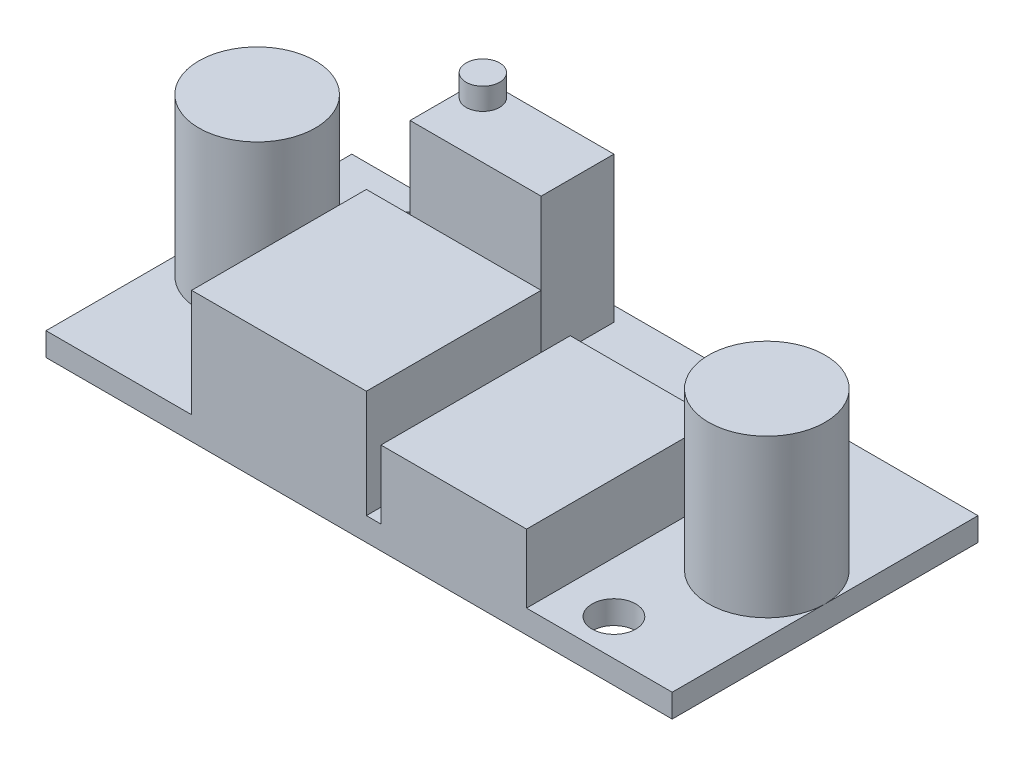
ISO-10303-21;
HEADER;
FILE_DESCRIPTION(('STEP AP214'),'2;1');
FILE_NAME('part.step','',(''),(''),'','','');
FILE_SCHEMA(('AUTOMOTIVE_DESIGN { 1 0 10303 214 1 1 1 1 }'));
ENDSEC;
DATA;
#1=APPLICATION_CONTEXT('core data for automotive mechanical design processes');
#2=APPLICATION_PROTOCOL_DEFINITION('international standard','automotive_design',2000,#1);
#3=PRODUCT_CONTEXT('',#1,'mechanical');
#4=PRODUCT('Part','Part','',(#3));
#5=PRODUCT_RELATED_PRODUCT_CATEGORY('part','',(#4));
#6=PRODUCT_DEFINITION_FORMATION('','',#4);
#7=PRODUCT_DEFINITION_CONTEXT('part definition',#1,'design');
#8=PRODUCT_DEFINITION('design','',#6,#7);
#9=PRODUCT_DEFINITION_SHAPE('','',#8);
#10=(LENGTH_UNIT() NAMED_UNIT(*) SI_UNIT(.MILLI.,.METRE.));
#11=(NAMED_UNIT(*) PLANE_ANGLE_UNIT() SI_UNIT($,.RADIAN.));
#12=(NAMED_UNIT(*) SI_UNIT($,.STERADIAN.) SOLID_ANGLE_UNIT());
#13=UNCERTAINTY_MEASURE_WITH_UNIT(LENGTH_MEASURE(1.E-05),#10,'distance_accuracy_value','');
#14=(GEOMETRIC_REPRESENTATION_CONTEXT(3) GLOBAL_UNCERTAINTY_ASSIGNED_CONTEXT((#13)) GLOBAL_UNIT_ASSIGNED_CONTEXT((#10,
#11,#12)) REPRESENTATION_CONTEXT('',''));
#15=CARTESIAN_POINT('',(0.,0.,0.));
#16=DIRECTION('',(0.,0.,1.));
#17=DIRECTION('',(1.,0.,0.));
#18=AXIS2_PLACEMENT_3D('',#15,#16,#17);
#19=CARTESIAN_POINT('',(0.,11.6,0.));
#20=DIRECTION('',(0.,1.,0.));
#21=DIRECTION('',(0.,0.,1.));
#22=AXIS2_PLACEMENT_3D('',#19,#20,#21);
#23=PLANE('',#22);
#24=CARTESIAN_POINT('',(-10.35,11.6,-8.35));
#25=DIRECTION('',(0.,1.,0.));
#26=DIRECTION('',(0.,0.,1.));
#27=AXIS2_PLACEMENT_3D('',#24,#25,#26);
#28=CIRCLE('',#27,1.15);
#29=CARTESIAN_POINT('',(-10.35,11.6,-9.5));
#30=VERTEX_POINT('',#29);
#31=CARTESIAN_POINT('',(-11.5,11.6,-8.35));
#32=VERTEX_POINT('',#31);
#33=EDGE_CURVE('E45',#30,#32,#28,.T.);
#34=ORIENTED_EDGE('',*,*,#33,.F.);
#35=DIRECTION('',(1.,0.,0.));
#36=VECTOR('',#35,1.);
#37=CARTESIAN_POINT('',(0.,11.6,-9.5));
#38=LINE('',#37,#36);
#39=CARTESIAN_POINT('',(-11.5,11.6,-9.5));
#40=VERTEX_POINT('',#39);
#41=EDGE_CURVE('E162',#40,#30,#38,.T.);
#42=ORIENTED_EDGE('',*,*,#41,.F.);
#43=DIRECTION('',(0.,0.,1.));
#44=VECTOR('',#43,1.);
#45=CARTESIAN_POINT('',(-11.5,11.6,0.));
#46=LINE('',#45,#44);
#47=EDGE_CURVE('E179',#40,#32,#46,.T.);
#48=ORIENTED_EDGE('',*,*,#47,.T.);
#49=EDGE_LOOP('',(#34,#42,#48));
#50=FACE_BOUND('',#49,.T.);
#51=ADVANCED_FACE('F35',(#50),#23,.T.);
#52=CARTESIAN_POINT('',(0.,1.6,0.));
#53=DIRECTION('',(0.,1.,0.));
#54=DIRECTION('',(0.,0.,1.));
#55=AXIS2_PLACEMENT_3D('',#52,#53,#54);
#56=PLANE('',#55);
#57=DIRECTION('',(0.,0.,1.));
#58=VECTOR('',#57,1.);
#59=CARTESIAN_POINT('',(-2.5,1.6,0.));
#60=LINE('',#59,#58);
#61=CARTESIAN_POINT('',(-2.5,1.6,-9.5));
#62=VERTEX_POINT('',#61);
#63=CARTESIAN_POINT('',(-2.5,1.6,-4.5));
#64=VERTEX_POINT('',#63);
#65=EDGE_CURVE('E454',#62,#64,#60,.T.);
#66=ORIENTED_EDGE('',*,*,#65,.T.);
#67=DIRECTION('',(1.,0.,0.));
#68=VECTOR('',#67,1.);
#69=CARTESIAN_POINT('',(0.,1.6,-4.5));
#70=LINE('',#69,#68);
#71=CARTESIAN_POINT('',(-11.5,1.6,-4.5));
#72=VERTEX_POINT('',#71);
#73=EDGE_CURVE('E447',#72,#64,#70,.T.);
#74=ORIENTED_EDGE('',*,*,#73,.F.);
#75=DIRECTION('',(0.,0.,1.));
#76=VECTOR('',#75,1.);
#77=CARTESIAN_POINT('',(-11.5,1.6,0.));
#78=LINE('',#77,#76);
#79=CARTESIAN_POINT('',(-11.5,1.6,-9.5));
#80=VERTEX_POINT('',#79);
#81=EDGE_CURVE('E449',#80,#72,#78,.T.);
#82=ORIENTED_EDGE('',*,*,#81,.F.);
#83=DIRECTION('',(1.,0.,0.));
#84=VECTOR('',#83,1.);
#85=CARTESIAN_POINT('',(0.,1.6,-9.5));
#86=LINE('',#85,#84);
#87=EDGE_CURVE('E451',#80,#62,#86,.T.);
#88=ORIENTED_EDGE('',*,*,#87,.T.);
#89=EDGE_LOOP('',(#66,#74,#82,#88));
#90=FACE_BOUND('',#89,.T.);
#91=CARTESIAN_POINT('',(15.,1.6,8.));
#92=DIRECTION('',(0.,1.,0.));
#93=DIRECTION('',(0.,0.,1.));
#94=AXIS2_PLACEMENT_3D('',#91,#92,#93);
#95=CIRCLE('',#94,1.5);
#96=CARTESIAN_POINT('',(15.,1.6,9.5));
#97=VERTEX_POINT('',#96);
#98=EDGE_CURVE('E336',#97,#97,#95,.T.);
#99=ORIENTED_EDGE('',*,*,#98,.F.);
#100=EDGE_LOOP('',(#99));
#101=FACE_BOUND('',#100,.T.);
#102=CARTESIAN_POINT('',(-15.,1.6,-7.99999999999999));
#103=DIRECTION('',(0.,1.,0.));
#104=DIRECTION('',(0.,0.,1.));
#105=AXIS2_PLACEMENT_3D('',#102,#103,#104);
#106=CIRCLE('',#105,1.5);
#107=CARTESIAN_POINT('',(-15.,1.6,-6.49999999999999));
#108=VERTEX_POINT('',#107);
#109=EDGE_CURVE('E346',#108,#108,#106,.T.);
#110=ORIENTED_EDGE('',*,*,#109,.F.);
#111=EDGE_LOOP('',(#110));
#112=FACE_BOUND('',#111,.T.);
#113=DIRECTION('',(1.,0.,0.));
#114=VECTOR('',#113,1.);
#115=CARTESIAN_POINT('',(0.,1.6,-2.5));
#116=LINE('',#115,#114);
#117=CARTESIAN_POINT('',(1.5,1.6,-2.5));
#118=VERTEX_POINT('',#117);
#119=CARTESIAN_POINT('',(11.5,1.6,-2.5));
#120=VERTEX_POINT('',#119);
#121=EDGE_CURVE('E370',#118,#120,#116,.T.);
#122=ORIENTED_EDGE('',*,*,#121,.T.);
#123=DIRECTION('',(0.,0.,-1.));
#124=VECTOR('',#123,1.);
#125=CARTESIAN_POINT('',(11.5,1.6,0.));
#126=LINE('',#125,#124);
#127=CARTESIAN_POINT('',(11.5,1.6,10.5));
#128=VERTEX_POINT('',#127);
#129=EDGE_CURVE('E368',#128,#120,#126,.T.);
#130=ORIENTED_EDGE('',*,*,#129,.F.);
#131=DIRECTION('',(1.,0.,0.));
#132=VECTOR('',#131,1.);
#133=CARTESIAN_POINT('',(-21.5,1.6,10.5));
#134=LINE('',#133,#132);
#135=CARTESIAN_POINT('',(21.5,1.6,10.5));
#136=VERTEX_POINT('',#135);
#137=EDGE_CURVE('E358',#128,#136,#134,.T.);
#138=ORIENTED_EDGE('',*,*,#137,.T.);
#139=DIRECTION('',(0.,0.,-1.));
#140=VECTOR('',#139,1.);
#141=CARTESIAN_POINT('',(21.5,1.6,-10.5));
#142=LINE('',#141,#140);
#143=CARTESIAN_POINT('',(21.5,1.6,0.));
#144=VERTEX_POINT('',#143);
#145=EDGE_CURVE('E354',#136,#144,#142,.T.);
#146=ORIENTED_EDGE('',*,*,#145,.T.);
#147=CARTESIAN_POINT('',(17.5,1.6,0.));
#148=DIRECTION('',(0.,1.,0.));
#149=DIRECTION('',(0.,0.,1.));
#150=AXIS2_PLACEMENT_3D('',#147,#148,#149);
#151=CIRCLE('',#150,4.);
#152=EDGE_CURVE('E339',#144,#144,#151,.T.);
#153=ORIENTED_EDGE('',*,*,#152,.F.);
#154=CARTESIAN_POINT('',(21.5,1.6,-10.5));
#155=VERTEX_POINT('',#154);
#156=EDGE_CURVE('E313',#144,#155,#142,.T.);
#157=ORIENTED_EDGE('',*,*,#156,.T.);
#158=DIRECTION('',(-1.,0.,0.));
#159=VECTOR('',#158,1.);
#160=CARTESIAN_POINT('',(-21.5,1.6,-10.5));
#161=LINE('',#160,#159);
#162=CARTESIAN_POINT('',(-21.5,1.6,-10.5));
#163=VERTEX_POINT('',#162);
#164=EDGE_CURVE('E327',#155,#163,#161,.T.);
#165=ORIENTED_EDGE('',*,*,#164,.T.);
#166=DIRECTION('',(0.,0.,1.));
#167=VECTOR('',#166,1.);
#168=CARTESIAN_POINT('',(-21.5,1.6,-10.5));
#169=LINE('',#168,#167);
#170=CARTESIAN_POINT('',(-21.5,1.6,0.));
#171=VERTEX_POINT('',#170);
#172=EDGE_CURVE('E308',#163,#171,#169,.T.);
#173=ORIENTED_EDGE('',*,*,#172,.T.);
#174=CARTESIAN_POINT('',(-17.5,1.6,0.));
#175=DIRECTION('',(0.,1.,0.));
#176=DIRECTION('',(0.,0.,1.));
#177=AXIS2_PLACEMENT_3D('',#174,#175,#176);
#178=CIRCLE('',#177,4.);
#179=EDGE_CURVE('E330',#171,#171,#178,.T.);
#180=ORIENTED_EDGE('',*,*,#179,.F.);
#181=CARTESIAN_POINT('',(-21.5,1.6,10.5));
#182=VERTEX_POINT('',#181);
#183=EDGE_CURVE('E324',#171,#182,#169,.T.);
#184=ORIENTED_EDGE('',*,*,#183,.T.);
#185=CARTESIAN_POINT('',(-11.5,1.6,10.5));
#186=VERTEX_POINT('',#185);
#187=EDGE_CURVE('E320',#182,#186,#134,.T.);
#188=ORIENTED_EDGE('',*,*,#187,.T.);
#189=DIRECTION('',(0.,0.,-1.));
#190=VECTOR('',#189,1.);
#191=CARTESIAN_POINT('',(-11.5,1.6,0.));
#192=LINE('',#191,#190);
#193=CARTESIAN_POINT('',(-11.5,1.6,-1.5));
#194=VERTEX_POINT('',#193);
#195=EDGE_CURVE('E391',#186,#194,#192,.T.);
#196=ORIENTED_EDGE('',*,*,#195,.T.);
#197=DIRECTION('',(1.,0.,0.));
#198=VECTOR('',#197,1.);
#199=CARTESIAN_POINT('',(0.,1.6,-1.5));
#200=LINE('',#199,#198);
#201=CARTESIAN_POINT('',(0.499999999999999,1.6,-1.5));
#202=VERTEX_POINT('',#201);
#203=EDGE_CURVE('E381',#194,#202,#200,.T.);
#204=ORIENTED_EDGE('',*,*,#203,.T.);
#205=DIRECTION('',(0.,0.,-1.));
#206=VECTOR('',#205,1.);
#207=CARTESIAN_POINT('',(0.499999999999999,1.6,0.));
#208=LINE('',#207,#206);
#209=CARTESIAN_POINT('',(0.499999999999997,1.6,10.5));
#210=VERTEX_POINT('',#209);
#211=EDGE_CURVE('E377',#210,#202,#208,.T.);
#212=ORIENTED_EDGE('',*,*,#211,.F.);
#213=CARTESIAN_POINT('',(1.5,1.6,10.5));
#214=VERTEX_POINT('',#213);
#215=EDGE_CURVE('E359',#210,#214,#134,.T.);
#216=ORIENTED_EDGE('',*,*,#215,.T.);
#217=DIRECTION('',(0.,0.,-1.));
#218=VECTOR('',#217,1.);
#219=CARTESIAN_POINT('',(1.5,1.6,0.));
#220=LINE('',#219,#218);
#221=EDGE_CURVE('E421',#214,#118,#220,.T.);
#222=ORIENTED_EDGE('',*,*,#221,.T.);
#223=EDGE_LOOP('',(#122,#130,#138,#146,#153,#157,#165,#173,#180,#184,#188,#196,#204,#212,#216,#222));
#224=FACE_BOUND('',#223,.T.);
#225=ADVANCED_FACE('F197',(#90,#101,#112,#224),#56,.T.);
#226=CARTESIAN_POINT('',(21.5,1.6,-10.5));
#227=DIRECTION('',(-1.,0.,0.));
#228=DIRECTION('',(0.,0.,1.));
#229=AXIS2_PLACEMENT_3D('',#226,#227,#228);
#230=PLANE('',#229);
#231=DIRECTION('',(0.,0.,-1.));
#232=VECTOR('',#231,1.);
#233=CARTESIAN_POINT('',(21.5,0.,-10.5));
#234=LINE('',#233,#232);
#235=CARTESIAN_POINT('',(21.5,0.,10.5));
#236=VERTEX_POINT('',#235);
#237=CARTESIAN_POINT('',(21.5,0.,-10.5));
#238=VERTEX_POINT('',#237);
#239=EDGE_CURVE('E303',#236,#238,#234,.T.);
#240=ORIENTED_EDGE('',*,*,#239,.T.);
#241=DIRECTION('',(0.,-1.,0.));
#242=VECTOR('',#241,1.);
#243=CARTESIAN_POINT('',(21.5,1.6,-10.5));
#244=LINE('',#243,#242);
#245=EDGE_CURVE('E39',#155,#238,#244,.T.);
#246=ORIENTED_EDGE('',*,*,#245,.F.);
#247=ORIENTED_EDGE('',*,*,#156,.F.);
#248=ORIENTED_EDGE('',*,*,#145,.F.);
#249=DIRECTION('',(0.,-1.,0.));
#250=VECTOR('',#249,1.);
#251=CARTESIAN_POINT('',(21.5,1.6,10.5));
#252=LINE('',#251,#250);
#253=EDGE_CURVE('E317',#136,#236,#252,.T.);
#254=ORIENTED_EDGE('',*,*,#253,.T.);
#255=EDGE_LOOP('',(#240,#246,#247,#248,#254));
#256=FACE_BOUND('',#255,.T.);
#257=ADVANCED_FACE('F37',(#256),#230,.F.);
#258=CARTESIAN_POINT('',(-21.5,1.6,-10.5));
#259=DIRECTION('',(0.,0.,1.));
#260=DIRECTION('',(1.,0.,0.));
#261=AXIS2_PLACEMENT_3D('',#258,#259,#260);
#262=PLANE('',#261);
#263=DIRECTION('',(-1.,0.,0.));
#264=VECTOR('',#263,1.);
#265=CARTESIAN_POINT('',(-21.5,0.,-10.5));
#266=LINE('',#265,#264);
#267=CARTESIAN_POINT('',(-21.5,0.,-10.5));
#268=VERTEX_POINT('',#267);
#269=EDGE_CURVE('E292',#238,#268,#266,.T.);
#270=ORIENTED_EDGE('',*,*,#269,.T.);
#271=DIRECTION('',(0.,-1.,0.));
#272=VECTOR('',#271,1.);
#273=CARTESIAN_POINT('',(-21.5,1.6,-10.5));
#274=LINE('',#273,#272);
#275=EDGE_CURVE('E295',#163,#268,#274,.T.);
#276=ORIENTED_EDGE('',*,*,#275,.F.);
#277=ORIENTED_EDGE('',*,*,#164,.F.);
#278=ORIENTED_EDGE('',*,*,#245,.T.);
#279=EDGE_LOOP('',(#270,#276,#277,#278));
#280=FACE_BOUND('',#279,.T.);
#281=ADVANCED_FACE('F282',(#280),#262,.F.);
#282=CARTESIAN_POINT('',(-21.5,1.6,-10.5));
#283=DIRECTION('',(1.,0.,0.));
#284=DIRECTION('',(0.,0.,-1.));
#285=AXIS2_PLACEMENT_3D('',#282,#283,#284);
#286=PLANE('',#285);
#287=DIRECTION('',(0.,0.,1.));
#288=VECTOR('',#287,1.);
#289=CARTESIAN_POINT('',(-21.5,0.,-10.5));
#290=LINE('',#289,#288);
#291=CARTESIAN_POINT('',(-21.5,0.,10.5));
#292=VERTEX_POINT('',#291);
#293=EDGE_CURVE('E302',#268,#292,#290,.T.);
#294=ORIENTED_EDGE('',*,*,#293,.T.);
#295=DIRECTION('',(0.,-1.,0.));
#296=VECTOR('',#295,1.);
#297=CARTESIAN_POINT('',(-21.5,1.6,10.5));
#298=LINE('',#297,#296);
#299=EDGE_CURVE('E309',#182,#292,#298,.T.);
#300=ORIENTED_EDGE('',*,*,#299,.F.);
#301=ORIENTED_EDGE('',*,*,#183,.F.);
#302=ORIENTED_EDGE('',*,*,#172,.F.);
#303=ORIENTED_EDGE('',*,*,#275,.T.);
#304=EDGE_LOOP('',(#294,#300,#301,#302,#303));
#305=FACE_BOUND('',#304,.T.);
#306=ADVANCED_FACE('F279',(#305),#286,.F.);
#307=CARTESIAN_POINT('',(-21.5,1.6,10.5));
#308=DIRECTION('',(0.,0.,-1.));
#309=DIRECTION('',(-1.,0.,0.));
#310=AXIS2_PLACEMENT_3D('',#307,#308,#309);
#311=PLANE('',#310);
#312=DIRECTION('',(1.,0.,0.));
#313=VECTOR('',#312,1.);
#314=CARTESIAN_POINT('',(-21.5,0.,10.5));
#315=LINE('',#314,#313);
#316=EDGE_CURVE('E311',#292,#236,#315,.T.);
#317=ORIENTED_EDGE('',*,*,#316,.T.);
#318=ORIENTED_EDGE('',*,*,#253,.F.);
#319=ORIENTED_EDGE('',*,*,#137,.F.);
#320=DIRECTION('',(0.,-1.,0.));
#321=VECTOR('',#320,1.);
#322=CARTESIAN_POINT('',(11.5,6.3,10.5));
#323=LINE('',#322,#321);
#324=CARTESIAN_POINT('',(11.5,6.3,10.5));
#325=VERTEX_POINT('',#324);
#326=EDGE_CURVE('E366',#325,#128,#323,.T.);
#327=ORIENTED_EDGE('',*,*,#326,.F.);
#328=DIRECTION('',(1.,0.,0.));
#329=VECTOR('',#328,1.);
#330=CARTESIAN_POINT('',(0.,6.3,10.5));
#331=LINE('',#330,#329);
#332=CARTESIAN_POINT('',(1.5,6.3,10.5));
#333=VERTEX_POINT('',#332);
#334=EDGE_CURVE('E426',#333,#325,#331,.T.);
#335=ORIENTED_EDGE('',*,*,#334,.F.);
#336=DIRECTION('',(0.,-1.,0.));
#337=VECTOR('',#336,1.);
#338=CARTESIAN_POINT('',(1.5,6.3,10.5));
#339=LINE('',#338,#337);
#340=EDGE_CURVE('E419',#333,#214,#339,.T.);
#341=ORIENTED_EDGE('',*,*,#340,.T.);
#342=ORIENTED_EDGE('',*,*,#215,.F.);
#343=DIRECTION('',(0.,-1.,0.));
#344=VECTOR('',#343,1.);
#345=CARTESIAN_POINT('',(0.499999999999999,9.,10.5));
#346=LINE('',#345,#344);
#347=CARTESIAN_POINT('',(0.499999999999999,9.,10.5));
#348=VERTEX_POINT('',#347);
#349=EDGE_CURVE('E409',#348,#210,#346,.T.);
#350=ORIENTED_EDGE('',*,*,#349,.F.);
#351=DIRECTION('',(1.,0.,0.));
#352=VECTOR('',#351,1.);
#353=CARTESIAN_POINT('',(0.,9.,10.5));
#354=LINE('',#353,#352);
#355=CARTESIAN_POINT('',(-11.5,9.,10.5));
#356=VERTEX_POINT('',#355);
#357=EDGE_CURVE('E387',#356,#348,#354,.T.);
#358=ORIENTED_EDGE('',*,*,#357,.F.);
#359=DIRECTION('',(0.,-1.,0.));
#360=VECTOR('',#359,1.);
#361=CARTESIAN_POINT('',(-11.5,9.,10.5));
#362=LINE('',#361,#360);
#363=EDGE_CURVE('E398',#356,#186,#362,.T.);
#364=ORIENTED_EDGE('',*,*,#363,.T.);
#365=ORIENTED_EDGE('',*,*,#187,.F.);
#366=ORIENTED_EDGE('',*,*,#299,.T.);
#367=EDGE_LOOP('',(#317,#318,#319,#327,#335,#341,#342,#350,#358,#364,#365,#366));
#368=FACE_BOUND('',#367,.T.);
#369=ADVANCED_FACE('F275',(#368),#311,.F.);
#370=CARTESIAN_POINT('',(0.,0.,0.));
#371=DIRECTION('',(0.,1.,0.));
#372=DIRECTION('',(0.,0.,1.));
#373=AXIS2_PLACEMENT_3D('',#370,#371,#372);
#374=PLANE('',#373);
#375=CARTESIAN_POINT('',(15.,0.,8.));
#376=DIRECTION('',(0.,1.,0.));
#377=DIRECTION('',(0.,0.,1.));
#378=AXIS2_PLACEMENT_3D('',#375,#376,#377);
#379=CIRCLE('',#378,1.5);
#380=CARTESIAN_POINT('',(15.,0.,9.5));
#381=VERTEX_POINT('',#380);
#382=EDGE_CURVE('E343',#381,#381,#379,.T.);
#383=ORIENTED_EDGE('',*,*,#382,.T.);
#384=EDGE_LOOP('',(#383));
#385=FACE_BOUND('',#384,.T.);
#386=CARTESIAN_POINT('',(-15.,0.,-7.99999999999999));
#387=DIRECTION('',(0.,1.,0.));
#388=DIRECTION('',(0.,0.,1.));
#389=AXIS2_PLACEMENT_3D('',#386,#387,#388);
#390=CIRCLE('',#389,1.5);
#391=CARTESIAN_POINT('',(-15.,0.,-6.49999999999999));
#392=VERTEX_POINT('',#391);
#393=EDGE_CURVE('E349',#392,#392,#390,.T.);
#394=ORIENTED_EDGE('',*,*,#393,.T.);
#395=EDGE_LOOP('',(#394));
#396=FACE_BOUND('',#395,.T.);
#397=ORIENTED_EDGE('',*,*,#239,.F.);
#398=ORIENTED_EDGE('',*,*,#316,.F.);
#399=ORIENTED_EDGE('',*,*,#293,.F.);
#400=ORIENTED_EDGE('',*,*,#269,.F.);
#401=EDGE_LOOP('',(#397,#398,#399,#400));
#402=FACE_BOUND('',#401,.T.);
#403=ADVANCED_FACE('F270',(#385,#396,#402),#374,.F.);
#404=CARTESIAN_POINT('',(-15.,0.,-7.99999999999999));
#405=DIRECTION('',(0.,1.,0.));
#406=DIRECTION('',(0.,0.,1.));
#407=AXIS2_PLACEMENT_3D('',#404,#405,#406);
#408=CYLINDRICAL_SURFACE('',#407,1.5);
#409=ORIENTED_EDGE('',*,*,#393,.F.);
#410=EDGE_LOOP('',(#409));
#411=FACE_BOUND('',#410,.T.);
#412=ORIENTED_EDGE('',*,*,#109,.T.);
#413=EDGE_LOOP('',(#412));
#414=FACE_BOUND('',#413,.T.);
#415=ADVANCED_FACE('F267',(#411,#414),#408,.F.);
#416=CARTESIAN_POINT('',(15.,0.,8.));
#417=DIRECTION('',(0.,1.,0.));
#418=DIRECTION('',(0.,0.,1.));
#419=AXIS2_PLACEMENT_3D('',#416,#417,#418);
#420=CYLINDRICAL_SURFACE('',#419,1.5);
#421=ORIENTED_EDGE('',*,*,#382,.F.);
#422=EDGE_LOOP('',(#421));
#423=FACE_BOUND('',#422,.T.);
#424=ORIENTED_EDGE('',*,*,#98,.T.);
#425=EDGE_LOOP('',(#424));
#426=FACE_BOUND('',#425,.T.);
#427=ADVANCED_FACE('F263',(#423,#426),#420,.F.);
#428=CARTESIAN_POINT('',(-17.5,12.4,0.));
#429=DIRECTION('',(0.,-1.,0.));
#430=DIRECTION('',(0.,0.,-1.));
#431=AXIS2_PLACEMENT_3D('',#428,#429,#430);
#432=CYLINDRICAL_SURFACE('',#431,4.);
#433=CARTESIAN_POINT('',(-17.5,12.4,0.));
#434=DIRECTION('',(0.,1.,0.));
#435=DIRECTION('',(0.,0.,1.));
#436=AXIS2_PLACEMENT_3D('',#433,#434,#435);
#437=CIRCLE('',#436,4.);
#438=CARTESIAN_POINT('',(-17.5,12.4,4.));
#439=VERTEX_POINT('',#438);
#440=EDGE_CURVE('E332',#439,#439,#437,.T.);
#441=ORIENTED_EDGE('',*,*,#440,.F.);
#442=EDGE_LOOP('',(#441));
#443=FACE_BOUND('',#442,.T.);
#444=ORIENTED_EDGE('',*,*,#179,.T.);
#445=EDGE_LOOP('',(#444));
#446=FACE_BOUND('',#445,.T.);
#447=ADVANCED_FACE('F259',(#443,#446),#432,.T.);
#448=CARTESIAN_POINT('',(0.,12.4,0.));
#449=DIRECTION('',(0.,1.,0.));
#450=DIRECTION('',(0.,0.,1.));
#451=AXIS2_PLACEMENT_3D('',#448,#449,#450);
#452=PLANE('',#451);
#453=ORIENTED_EDGE('',*,*,#440,.T.);
#454=EDGE_LOOP('',(#453));
#455=FACE_BOUND('',#454,.T.);
#456=ADVANCED_FACE('F255',(#455),#452,.T.);
#457=CARTESIAN_POINT('',(17.5,12.4,0.));
#458=DIRECTION('',(0.,-1.,0.));
#459=DIRECTION('',(0.,0.,-1.));
#460=AXIS2_PLACEMENT_3D('',#457,#458,#459);
#461=CYLINDRICAL_SURFACE('',#460,4.);
#462=CARTESIAN_POINT('',(17.5,12.4,0.));
#463=DIRECTION('',(0.,1.,0.));
#464=DIRECTION('',(0.,0.,1.));
#465=AXIS2_PLACEMENT_3D('',#462,#463,#464);
#466=CIRCLE('',#465,4.);
#467=CARTESIAN_POINT('',(17.5,12.4,3.99999999999999));
#468=VERTEX_POINT('',#467);
#469=EDGE_CURVE('E333',#468,#468,#466,.T.);
#470=ORIENTED_EDGE('',*,*,#469,.F.);
#471=EDGE_LOOP('',(#470));
#472=FACE_BOUND('',#471,.T.);
#473=ORIENTED_EDGE('',*,*,#152,.T.);
#474=EDGE_LOOP('',(#473));
#475=FACE_BOUND('',#474,.T.);
#476=ADVANCED_FACE('F251',(#472,#475),#461,.T.);
#477=CARTESIAN_POINT('',(0.,12.4,0.));
#478=DIRECTION('',(0.,1.,0.));
#479=DIRECTION('',(0.,0.,1.));
#480=AXIS2_PLACEMENT_3D('',#477,#478,#479);
#481=PLANE('',#480);
#482=ORIENTED_EDGE('',*,*,#469,.T.);
#483=EDGE_LOOP('',(#482));
#484=FACE_BOUND('',#483,.T.);
#485=ADVANCED_FACE('F247',(#484),#481,.T.);
#486=CARTESIAN_POINT('',(0.499999999999999,9.,0.));
#487=DIRECTION('',(-1.,0.,0.));
#488=DIRECTION('',(0.,0.,1.));
#489=AXIS2_PLACEMENT_3D('',#486,#487,#488);
#490=PLANE('',#489);
#491=ORIENTED_EDGE('',*,*,#211,.T.);
#492=DIRECTION('',(0.,-1.,0.));
#493=VECTOR('',#492,1.);
#494=CARTESIAN_POINT('',(0.499999999999999,9.,-1.5));
#495=LINE('',#494,#493);
#496=CARTESIAN_POINT('',(0.499999999999999,9.,-1.5));
#497=VERTEX_POINT('',#496);
#498=EDGE_CURVE('E406',#497,#202,#495,.T.);
#499=ORIENTED_EDGE('',*,*,#498,.F.);
#500=DIRECTION('',(0.,0.,-1.));
#501=VECTOR('',#500,1.);
#502=CARTESIAN_POINT('',(0.499999999999999,9.,0.));
#503=LINE('',#502,#501);
#504=EDGE_CURVE('E390',#348,#497,#503,.T.);
#505=ORIENTED_EDGE('',*,*,#504,.F.);
#506=ORIENTED_EDGE('',*,*,#349,.T.);
#507=EDGE_LOOP('',(#491,#499,#505,#506));
#508=FACE_BOUND('',#507,.T.);
#509=ADVANCED_FACE('F243',(#508),#490,.F.);
#510=CARTESIAN_POINT('',(0.,9.,-1.5));
#511=DIRECTION('',(0.,0.,-1.));
#512=DIRECTION('',(-1.,0.,0.));
#513=AXIS2_PLACEMENT_3D('',#510,#511,#512);
#514=PLANE('',#513);
#515=ORIENTED_EDGE('',*,*,#203,.F.);
#516=DIRECTION('',(0.,-1.,0.));
#517=VECTOR('',#516,1.);
#518=CARTESIAN_POINT('',(-11.5,9.,-1.5));
#519=LINE('',#518,#517);
#520=CARTESIAN_POINT('',(-11.5,9.,-1.5));
#521=VERTEX_POINT('',#520);
#522=EDGE_CURVE('E403',#521,#194,#519,.T.);
#523=ORIENTED_EDGE('',*,*,#522,.F.);
#524=DIRECTION('',(1.,0.,0.));
#525=VECTOR('',#524,1.);
#526=CARTESIAN_POINT('',(0.,9.,-1.5));
#527=LINE('',#526,#525);
#528=EDGE_CURVE('E393',#521,#497,#527,.T.);
#529=ORIENTED_EDGE('',*,*,#528,.T.);
#530=ORIENTED_EDGE('',*,*,#498,.T.);
#531=EDGE_LOOP('',(#515,#523,#529,#530));
#532=FACE_BOUND('',#531,.T.);
#533=ADVANCED_FACE('F239',(#532),#514,.T.);
#534=CARTESIAN_POINT('',(-11.5,9.,0.));
#535=DIRECTION('',(-1.,0.,0.));
#536=DIRECTION('',(0.,0.,1.));
#537=AXIS2_PLACEMENT_3D('',#534,#535,#536);
#538=PLANE('',#537);
#539=ORIENTED_EDGE('',*,*,#195,.F.);
#540=ORIENTED_EDGE('',*,*,#363,.F.);
#541=DIRECTION('',(0.,0.,-1.));
#542=VECTOR('',#541,1.);
#543=CARTESIAN_POINT('',(-11.5,9.,0.));
#544=LINE('',#543,#542);
#545=EDGE_CURVE('E396',#356,#521,#544,.T.);
#546=ORIENTED_EDGE('',*,*,#545,.T.);
#547=ORIENTED_EDGE('',*,*,#522,.T.);
#548=EDGE_LOOP('',(#539,#540,#546,#547));
#549=FACE_BOUND('',#548,.T.);
#550=ADVANCED_FACE('F235',(#549),#538,.T.);
#551=CARTESIAN_POINT('',(0.,9.,0.));
#552=DIRECTION('',(0.,1.,0.));
#553=DIRECTION('',(0.,0.,1.));
#554=AXIS2_PLACEMENT_3D('',#551,#552,#553);
#555=PLANE('',#554);
#556=ORIENTED_EDGE('',*,*,#357,.T.);
#557=ORIENTED_EDGE('',*,*,#504,.T.);
#558=ORIENTED_EDGE('',*,*,#528,.F.);
#559=ORIENTED_EDGE('',*,*,#545,.F.);
#560=EDGE_LOOP('',(#556,#557,#558,#559));
#561=FACE_BOUND('',#560,.T.);
#562=ADVANCED_FACE('F231',(#561),#555,.T.);
#563=CARTESIAN_POINT('',(11.5,6.3,0.));
#564=DIRECTION('',(-1.,0.,0.));
#565=DIRECTION('',(0.,0.,1.));
#566=AXIS2_PLACEMENT_3D('',#563,#564,#565);
#567=PLANE('',#566);
#568=ORIENTED_EDGE('',*,*,#129,.T.);
#569=DIRECTION('',(0.,-1.,0.));
#570=VECTOR('',#569,1.);
#571=CARTESIAN_POINT('',(11.5,6.3,-2.5));
#572=LINE('',#571,#570);
#573=CARTESIAN_POINT('',(11.5,6.3,-2.5));
#574=VERTEX_POINT('',#573);
#575=EDGE_CURVE('E378',#574,#120,#572,.T.);
#576=ORIENTED_EDGE('',*,*,#575,.F.);
#577=DIRECTION('',(0.,0.,-1.));
#578=VECTOR('',#577,1.);
#579=CARTESIAN_POINT('',(11.5,6.3,0.));
#580=LINE('',#579,#578);
#581=EDGE_CURVE('E375',#325,#574,#580,.T.);
#582=ORIENTED_EDGE('',*,*,#581,.F.);
#583=ORIENTED_EDGE('',*,*,#326,.T.);
#584=EDGE_LOOP('',(#568,#576,#582,#583));
#585=FACE_BOUND('',#584,.T.);
#586=ADVANCED_FACE('F227',(#585),#567,.F.);
#587=CARTESIAN_POINT('',(0.,6.3,-2.5));
#588=DIRECTION('',(0.,0.,-1.));
#589=DIRECTION('',(-1.,0.,0.));
#590=AXIS2_PLACEMENT_3D('',#587,#588,#589);
#591=PLANE('',#590);
#592=ORIENTED_EDGE('',*,*,#121,.F.);
#593=DIRECTION('',(0.,-1.,0.));
#594=VECTOR('',#593,1.);
#595=CARTESIAN_POINT('',(1.5,6.3,-2.5));
#596=LINE('',#595,#594);
#597=CARTESIAN_POINT('',(1.5,6.3,-2.5));
#598=VERTEX_POINT('',#597);
#599=EDGE_CURVE('E383',#598,#118,#596,.T.);
#600=ORIENTED_EDGE('',*,*,#599,.F.);
#601=DIRECTION('',(1.,0.,0.));
#602=VECTOR('',#601,1.);
#603=CARTESIAN_POINT('',(0.,6.3,-2.5));
#604=LINE('',#603,#602);
#605=EDGE_CURVE('E436',#598,#574,#604,.T.);
#606=ORIENTED_EDGE('',*,*,#605,.T.);
#607=ORIENTED_EDGE('',*,*,#575,.T.);
#608=EDGE_LOOP('',(#592,#600,#606,#607));
#609=FACE_BOUND('',#608,.T.);
#610=ADVANCED_FACE('F223',(#609),#591,.T.);
#611=CARTESIAN_POINT('',(1.5,6.3,0.));
#612=DIRECTION('',(-1.,0.,0.));
#613=DIRECTION('',(0.,0.,1.));
#614=AXIS2_PLACEMENT_3D('',#611,#612,#613);
#615=PLANE('',#614);
#616=ORIENTED_EDGE('',*,*,#221,.F.);
#617=ORIENTED_EDGE('',*,*,#340,.F.);
#618=DIRECTION('',(0.,0.,-1.));
#619=VECTOR('',#618,1.);
#620=CARTESIAN_POINT('',(1.5,6.3,0.));
#621=LINE('',#620,#619);
#622=EDGE_CURVE('E430',#333,#598,#621,.T.);
#623=ORIENTED_EDGE('',*,*,#622,.T.);
#624=ORIENTED_EDGE('',*,*,#599,.T.);
#625=EDGE_LOOP('',(#616,#617,#623,#624));
#626=FACE_BOUND('',#625,.T.);
#627=ADVANCED_FACE('F219',(#626),#615,.T.);
#628=CARTESIAN_POINT('',(0.,6.3,0.));
#629=DIRECTION('',(0.,1.,0.));
#630=DIRECTION('',(0.,0.,1.));
#631=AXIS2_PLACEMENT_3D('',#628,#629,#630);
#632=PLANE('',#631);
#633=ORIENTED_EDGE('',*,*,#334,.T.);
#634=ORIENTED_EDGE('',*,*,#581,.T.);
#635=ORIENTED_EDGE('',*,*,#605,.F.);
#636=ORIENTED_EDGE('',*,*,#622,.F.);
#637=EDGE_LOOP('',(#633,#634,#635,#636));
#638=FACE_BOUND('',#637,.T.);
#639=ADVANCED_FACE('F215',(#638),#632,.T.);
#640=CARTESIAN_POINT('',(-2.5,11.6,0.));
#641=DIRECTION('',(1.,0.,0.));
#642=DIRECTION('',(0.,0.,-1.));
#643=AXIS2_PLACEMENT_3D('',#640,#641,#642);
#644=PLANE('',#643);
#645=ORIENTED_EDGE('',*,*,#65,.F.);
#646=DIRECTION('',(0.,-1.,0.));
#647=VECTOR('',#646,1.);
#648=CARTESIAN_POINT('',(-2.5,11.6,-9.5));
#649=LINE('',#648,#647);
#650=CARTESIAN_POINT('',(-2.5,11.6,-9.5));
#651=VERTEX_POINT('',#650);
#652=EDGE_CURVE('E373',#651,#62,#649,.T.);
#653=ORIENTED_EDGE('',*,*,#652,.F.);
#654=DIRECTION('',(0.,0.,1.));
#655=VECTOR('',#654,1.);
#656=CARTESIAN_POINT('',(-2.5,11.6,0.));
#657=LINE('',#656,#655);
#658=CARTESIAN_POINT('',(-2.5,11.6,-4.5));
#659=VERTEX_POINT('',#658);
#660=EDGE_CURVE('E177',#651,#659,#657,.T.);
#661=ORIENTED_EDGE('',*,*,#660,.T.);
#662=DIRECTION('',(0.,-1.,0.));
#663=VECTOR('',#662,1.);
#664=CARTESIAN_POINT('',(-2.5,11.6,-4.5));
#665=LINE('',#664,#663);
#666=EDGE_CURVE('E444',#659,#64,#665,.T.);
#667=ORIENTED_EDGE('',*,*,#666,.T.);
#668=EDGE_LOOP('',(#645,#653,#661,#667));
#669=FACE_BOUND('',#668,.T.);
#670=ADVANCED_FACE('F212',(#669),#644,.T.);
#671=CARTESIAN_POINT('',(0.,11.6,-9.5));
#672=DIRECTION('',(0.,0.,-1.));
#673=DIRECTION('',(-1.,0.,0.));
#674=AXIS2_PLACEMENT_3D('',#671,#672,#673);
#675=PLANE('',#674);
#676=ORIENTED_EDGE('',*,*,#87,.F.);
#677=DIRECTION('',(0.,-1.,0.));
#678=VECTOR('',#677,1.);
#679=CARTESIAN_POINT('',(-11.5,11.6,-9.5));
#680=LINE('',#679,#678);
#681=EDGE_CURVE('E167',#40,#80,#680,.T.);
#682=ORIENTED_EDGE('',*,*,#681,.F.);
#683=ORIENTED_EDGE('',*,*,#41,.T.);
#684=EDGE_CURVE('E165',#30,#651,#38,.T.);
#685=ORIENTED_EDGE('',*,*,#684,.T.);
#686=ORIENTED_EDGE('',*,*,#652,.T.);
#687=EDGE_LOOP('',(#676,#682,#683,#685,#686));
#688=FACE_BOUND('',#687,.T.);
#689=ADVANCED_FACE('F164',(#688),#675,.T.);
#690=CARTESIAN_POINT('',(-11.5,11.6,0.));
#691=DIRECTION('',(1.,0.,0.));
#692=DIRECTION('',(0.,0.,-1.));
#693=AXIS2_PLACEMENT_3D('',#690,#691,#692);
#694=PLANE('',#693);
#695=ORIENTED_EDGE('',*,*,#81,.T.);
#696=DIRECTION('',(0.,-1.,0.));
#697=VECTOR('',#696,1.);
#698=CARTESIAN_POINT('',(-11.5,11.6,-4.5));
#699=LINE('',#698,#697);
#700=CARTESIAN_POINT('',(-11.5,11.6,-4.5));
#701=VERTEX_POINT('',#700);
#702=EDGE_CURVE('E58',#701,#72,#699,.T.);
#703=ORIENTED_EDGE('',*,*,#702,.F.);
#704=EDGE_CURVE('E172',#32,#701,#46,.T.);
#705=ORIENTED_EDGE('',*,*,#704,.F.);
#706=ORIENTED_EDGE('',*,*,#47,.F.);
#707=ORIENTED_EDGE('',*,*,#681,.T.);
#708=EDGE_LOOP('',(#695,#703,#705,#706,#707));
#709=FACE_BOUND('',#708,.T.);
#710=ADVANCED_FACE('F206',(#709),#694,.F.);
#711=CARTESIAN_POINT('',(0.,11.6,-4.5));
#712=DIRECTION('',(0.,0.,-1.));
#713=DIRECTION('',(-1.,0.,0.));
#714=AXIS2_PLACEMENT_3D('',#711,#712,#713);
#715=PLANE('',#714);
#716=ORIENTED_EDGE('',*,*,#73,.T.);
#717=ORIENTED_EDGE('',*,*,#666,.F.);
#718=DIRECTION('',(1.,0.,0.));
#719=VECTOR('',#718,1.);
#720=CARTESIAN_POINT('',(0.,11.6,-4.5));
#721=LINE('',#720,#719);
#722=EDGE_CURVE('E446',#701,#659,#721,.T.);
#723=ORIENTED_EDGE('',*,*,#722,.F.);
#724=ORIENTED_EDGE('',*,*,#702,.T.);
#725=EDGE_LOOP('',(#716,#717,#723,#724));
#726=FACE_BOUND('',#725,.T.);
#727=ADVANCED_FACE('F193',(#726),#715,.F.);
#728=EDGE_CURVE('E11',#32,#30,#28,.T.);
#729=ORIENTED_EDGE('',*,*,#728,.F.);
#730=ORIENTED_EDGE('',*,*,#704,.T.);
#731=ORIENTED_EDGE('',*,*,#722,.T.);
#732=ORIENTED_EDGE('',*,*,#660,.F.);
#733=ORIENTED_EDGE('',*,*,#684,.F.);
#734=EDGE_LOOP('',(#729,#730,#731,#732,#733));
#735=FACE_BOUND('',#734,.T.);
#736=ADVANCED_FACE('F175',(#735),#23,.T.);
#737=CARTESIAN_POINT('',(-10.35,13.1,-8.35));
#738=DIRECTION('',(0.,-1.,0.));
#739=DIRECTION('',(0.,0.,-1.));
#740=AXIS2_PLACEMENT_3D('',#737,#738,#739);
#741=CYLINDRICAL_SURFACE('',#740,1.15);
#742=CARTESIAN_POINT('',(-10.35,13.1,-8.35));
#743=DIRECTION('',(0.,1.,0.));
#744=DIRECTION('',(0.,0.,1.));
#745=AXIS2_PLACEMENT_3D('',#742,#743,#744);
#746=CIRCLE('',#745,1.15);
#747=CARTESIAN_POINT('',(-10.35,13.1,-7.2));
#748=VERTEX_POINT('',#747);
#749=EDGE_CURVE('E181',#748,#748,#746,.T.);
#750=ORIENTED_EDGE('',*,*,#749,.F.);
#751=EDGE_LOOP('',(#750));
#752=FACE_BOUND('',#751,.T.);
#753=ORIENTED_EDGE('',*,*,#33,.T.);
#754=ORIENTED_EDGE('',*,*,#728,.T.);
#755=EDGE_LOOP('',(#753,#754));
#756=FACE_BOUND('',#755,.T.);
#757=ADVANCED_FACE('F182',(#752,#756),#741,.T.);
#758=CARTESIAN_POINT('',(-10.35,13.1,-8.35));
#759=DIRECTION('',(0.,1.,0.));
#760=DIRECTION('',(0.,0.,1.));
#761=AXIS2_PLACEMENT_3D('',#758,#759,#760);
#762=PLANE('',#761);
#763=ORIENTED_EDGE('',*,*,#749,.T.);
#764=EDGE_LOOP('',(#763));
#765=FACE_BOUND('',#764,.T.);
#766=ADVANCED_FACE('F184',(#765),#762,.T.);
#767=CLOSED_SHELL('',(#51,#225,#257,#281,#306,#369,#403,#415,#427,#447,#456,#476,#485,#509,#533,
#550,#562,#586,#610,#627,#639,#670,#689,#710,#727,#736,#757,#766));
#768=MANIFOLD_SOLID_BREP('B2',#767);
#769=ADVANCED_BREP_SHAPE_REPRESENTATION('',(#18,#768),#14);
#770=SHAPE_DEFINITION_REPRESENTATION(#9,#769);
ENDSEC;
END-ISO-10303-21;
